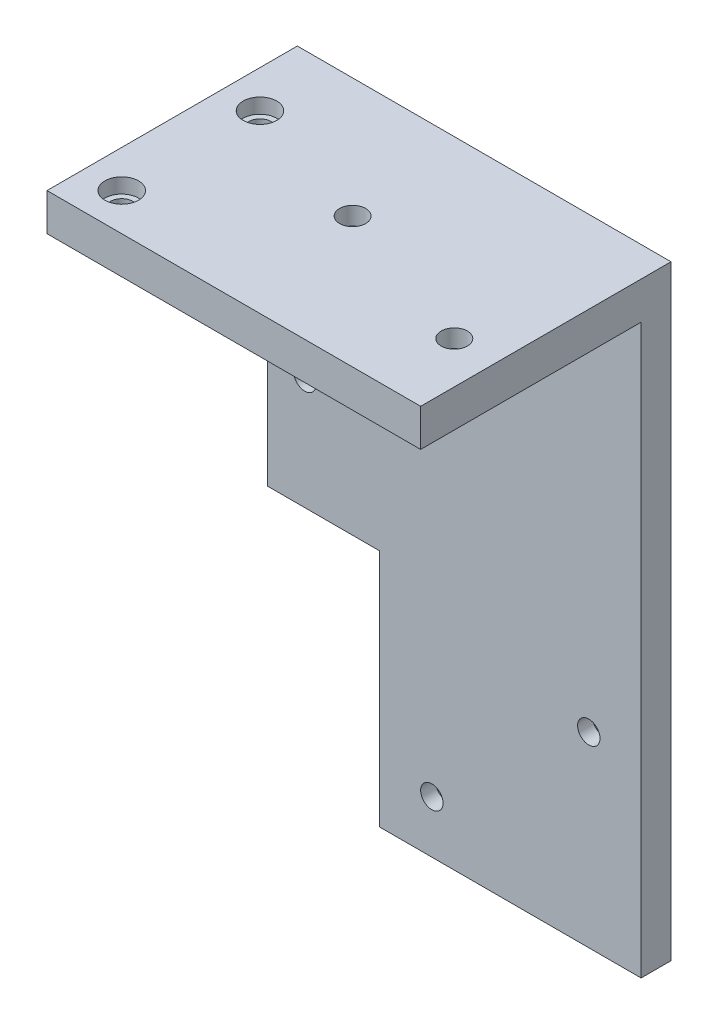
ISO-10303-21;
HEADER;
FILE_DESCRIPTION(('STEP AP214'),'2;1');
FILE_NAME('part.step','',(''),(''),'','','');
FILE_SCHEMA(('AUTOMOTIVE_DESIGN { 1 0 10303 214 1 1 1 1 }'));
ENDSEC;
DATA;
#1=APPLICATION_CONTEXT('core data for automotive mechanical design processes');
#2=APPLICATION_PROTOCOL_DEFINITION('international standard','automotive_design',2000,#1);
#3=PRODUCT_CONTEXT('',#1,'mechanical');
#4=PRODUCT('Part','Part','',(#3));
#5=PRODUCT_RELATED_PRODUCT_CATEGORY('part','',(#4));
#6=PRODUCT_DEFINITION_FORMATION('','',#4);
#7=PRODUCT_DEFINITION_CONTEXT('part definition',#1,'design');
#8=PRODUCT_DEFINITION('design','',#6,#7);
#9=PRODUCT_DEFINITION_SHAPE('','',#8);
#10=(LENGTH_UNIT() NAMED_UNIT(*) SI_UNIT(.MILLI.,.METRE.));
#11=(NAMED_UNIT(*) PLANE_ANGLE_UNIT() SI_UNIT($,.RADIAN.));
#12=(NAMED_UNIT(*) SI_UNIT($,.STERADIAN.) SOLID_ANGLE_UNIT());
#13=UNCERTAINTY_MEASURE_WITH_UNIT(LENGTH_MEASURE(1.E-05),#10,'distance_accuracy_value','');
#14=(GEOMETRIC_REPRESENTATION_CONTEXT(3) GLOBAL_UNCERTAINTY_ASSIGNED_CONTEXT((#13)) GLOBAL_UNIT_ASSIGNED_CONTEXT((#10,
#11,#12)) REPRESENTATION_CONTEXT('',''));
#15=CARTESIAN_POINT('',(0.,0.,0.));
#16=DIRECTION('',(0.,0.,1.));
#17=DIRECTION('',(1.,0.,0.));
#18=AXIS2_PLACEMENT_3D('',#15,#16,#17);
#19=CARTESIAN_POINT('',(22.,-69.,29.5));
#20=DIRECTION('',(0.,0.,-1.));
#21=DIRECTION('',(-1.,0.,0.));
#22=AXIS2_PLACEMENT_3D('',#19,#20,#21);
#23=CYLINDRICAL_SURFACE('',#22,1.5);
#24=CARTESIAN_POINT('',(22.,-69.,0.));
#25=DIRECTION('',(0.,0.,-1.));
#26=DIRECTION('',(-1.,0.,0.));
#27=AXIS2_PLACEMENT_3D('',#24,#25,#26);
#28=CIRCLE('',#27,1.5);
#29=CARTESIAN_POINT('',(20.5,-69.,0.));
#30=VERTEX_POINT('',#29);
#31=EDGE_CURVE('E166',#30,#30,#28,.T.);
#32=ORIENTED_EDGE('',*,*,#31,.F.);
#33=EDGE_LOOP('',(#32));
#34=FACE_BOUND('',#33,.T.);
#35=CARTESIAN_POINT('',(22.,-69.,-2.));
#36=DIRECTION('',(0.,0.,-1.));
#37=DIRECTION('',(-1.,0.,0.));
#38=AXIS2_PLACEMENT_3D('',#35,#36,#37);
#39=CIRCLE('',#38,1.5);
#40=CARTESIAN_POINT('',(20.5,-69.,-2.));
#41=VERTEX_POINT('',#40);
#42=EDGE_CURVE('E69',#41,#41,#39,.F.);
#43=ORIENTED_EDGE('',*,*,#42,.F.);
#44=EDGE_LOOP('',(#43));
#45=FACE_BOUND('',#44,.T.);
#46=ADVANCED_FACE('F65',(#34,#45),#23,.F.);
#47=CARTESIAN_POINT('',(43.,-51.,29.5));
#48=DIRECTION('',(0.,0.,-1.));
#49=DIRECTION('',(-1.,0.,0.));
#50=AXIS2_PLACEMENT_3D('',#47,#48,#49);
#51=CYLINDRICAL_SURFACE('',#50,1.5);
#52=CARTESIAN_POINT('',(43.,-51.,0.));
#53=DIRECTION('',(0.,0.,-1.));
#54=DIRECTION('',(-1.,0.,0.));
#55=AXIS2_PLACEMENT_3D('',#52,#53,#54);
#56=CIRCLE('',#55,1.5);
#57=CARTESIAN_POINT('',(41.5,-51.,0.));
#58=VERTEX_POINT('',#57);
#59=EDGE_CURVE('E183',#58,#58,#56,.T.);
#60=ORIENTED_EDGE('',*,*,#59,.F.);
#61=EDGE_LOOP('',(#60));
#62=FACE_BOUND('',#61,.T.);
#63=CARTESIAN_POINT('',(43.,-51.,-2.));
#64=DIRECTION('',(0.,0.,-1.));
#65=DIRECTION('',(-1.,0.,0.));
#66=AXIS2_PLACEMENT_3D('',#63,#64,#65);
#67=CIRCLE('',#66,1.5);
#68=CARTESIAN_POINT('',(41.5,-51.,-2.));
#69=VERTEX_POINT('',#68);
#70=EDGE_CURVE('E160',#69,#69,#67,.F.);
#71=ORIENTED_EDGE('',*,*,#70,.F.);
#72=EDGE_LOOP('',(#71));
#73=FACE_BOUND('',#72,.T.);
#74=ADVANCED_FACE('F316',(#62,#73),#51,.F.);
#75=CARTESIAN_POINT('',(5.,-29.,29.5));
#76=DIRECTION('',(0.,0.,-1.));
#77=DIRECTION('',(-1.,0.,0.));
#78=AXIS2_PLACEMENT_3D('',#75,#76,#77);
#79=CYLINDRICAL_SURFACE('',#78,1.5);
#80=CARTESIAN_POINT('',(5.,-29.,0.));
#81=DIRECTION('',(0.,0.,-1.));
#82=DIRECTION('',(-1.,0.,0.));
#83=AXIS2_PLACEMENT_3D('',#80,#81,#82);
#84=CIRCLE('',#83,1.5);
#85=CARTESIAN_POINT('',(3.5,-29.,0.));
#86=VERTEX_POINT('',#85);
#87=EDGE_CURVE('E158',#86,#86,#84,.T.);
#88=ORIENTED_EDGE('',*,*,#87,.F.);
#89=EDGE_LOOP('',(#88));
#90=FACE_BOUND('',#89,.T.);
#91=CARTESIAN_POINT('',(5.,-29.,-2.));
#92=DIRECTION('',(0.,0.,-1.));
#93=DIRECTION('',(-1.,0.,0.));
#94=AXIS2_PLACEMENT_3D('',#91,#92,#93);
#95=CIRCLE('',#94,1.5);
#96=CARTESIAN_POINT('',(3.5,-29.,-2.));
#97=VERTEX_POINT('',#96);
#98=EDGE_CURVE('E156',#97,#97,#95,.F.);
#99=ORIENTED_EDGE('',*,*,#98,.F.);
#100=EDGE_LOOP('',(#99));
#101=FACE_BOUND('',#100,.T.);
#102=ADVANCED_FACE('F322',(#90,#101),#79,.F.);
#103=CARTESIAN_POINT('',(5.,-44.,24.5));
#104=DIRECTION('',(0.,1.,0.));
#105=DIRECTION('',(0.,0.,1.));
#106=AXIS2_PLACEMENT_3D('',#103,#104,#105);
#107=CYLINDRICAL_SURFACE('',#106,1.5);
#108=CARTESIAN_POINT('',(5.,0.,24.5));
#109=DIRECTION('',(0.,1.,0.));
#110=DIRECTION('',(0.,0.,1.));
#111=AXIS2_PLACEMENT_3D('',#108,#109,#110);
#112=CIRCLE('',#111,1.5);
#113=CARTESIAN_POINT('',(5.,0.,26.));
#114=VERTEX_POINT('',#113);
#115=EDGE_CURVE('E142',#114,#114,#112,.T.);
#116=ORIENTED_EDGE('',*,*,#115,.F.);
#117=EDGE_LOOP('',(#116));
#118=FACE_BOUND('',#117,.T.);
#119=CARTESIAN_POINT('',(5.,3.,24.5));
#120=DIRECTION('',(0.,1.,0.));
#121=DIRECTION('',(0.,0.,1.));
#122=AXIS2_PLACEMENT_3D('',#119,#120,#121);
#123=CIRCLE('',#122,1.5);
#124=CARTESIAN_POINT('',(5.,3.,26.));
#125=VERTEX_POINT('',#124);
#126=EDGE_CURVE('E146',#125,#125,#123,.F.);
#127=ORIENTED_EDGE('',*,*,#126,.F.);
#128=EDGE_LOOP('',(#127));
#129=FACE_BOUND('',#128,.T.);
#130=ADVANCED_FACE('F344',(#118,#129),#107,.F.);
#131=CARTESIAN_POINT('',(5.,-44.,6.));
#132=DIRECTION('',(0.,1.,0.));
#133=DIRECTION('',(0.,0.,1.));
#134=AXIS2_PLACEMENT_3D('',#131,#132,#133);
#135=CYLINDRICAL_SURFACE('',#134,1.5);
#136=CARTESIAN_POINT('',(5.,0.,6.));
#137=DIRECTION('',(0.,1.,0.));
#138=DIRECTION('',(0.,0.,1.));
#139=AXIS2_PLACEMENT_3D('',#136,#137,#138);
#140=CIRCLE('',#139,1.5);
#141=CARTESIAN_POINT('',(5.,0.,7.5));
#142=VERTEX_POINT('',#141);
#143=EDGE_CURVE('E145',#142,#142,#140,.T.);
#144=ORIENTED_EDGE('',*,*,#143,.F.);
#145=EDGE_LOOP('',(#144));
#146=FACE_BOUND('',#145,.T.);
#147=CARTESIAN_POINT('',(5.,3.,6.));
#148=DIRECTION('',(0.,1.,0.));
#149=DIRECTION('',(0.,0.,1.));
#150=AXIS2_PLACEMENT_3D('',#147,#148,#149);
#151=CIRCLE('',#150,1.5);
#152=CARTESIAN_POINT('',(5.,3.,7.5));
#153=VERTEX_POINT('',#152);
#154=EDGE_CURVE('E150',#153,#153,#151,.F.);
#155=ORIENTED_EDGE('',*,*,#154,.F.);
#156=EDGE_LOOP('',(#155));
#157=FACE_BOUND('',#156,.T.);
#158=ADVANCED_FACE('F357',(#146,#157),#135,.F.);
#159=CARTESIAN_POINT('',(0.,5.,0.));
#160=DIRECTION('',(0.,1.,0.));
#161=DIRECTION('',(0.,0.,1.));
#162=AXIS2_PLACEMENT_3D('',#159,#160,#161);
#163=PLANE('',#162);
#164=CARTESIAN_POINT('',(5.,5.,6.));
#165=DIRECTION('',(0.,1.,0.));
#166=DIRECTION('',(0.,0.,1.));
#167=AXIS2_PLACEMENT_3D('',#164,#165,#166);
#168=CIRCLE('',#167,2.25);
#169=CARTESIAN_POINT('',(5.,5.,8.25));
#170=VERTEX_POINT('',#169);
#171=EDGE_CURVE('E215',#170,#170,#168,.T.);
#172=ORIENTED_EDGE('',*,*,#171,.F.);
#173=EDGE_LOOP('',(#172));
#174=FACE_BOUND('',#173,.T.);
#175=CARTESIAN_POINT('',(5.,5.,24.5));
#176=DIRECTION('',(0.,1.,0.));
#177=DIRECTION('',(0.,0.,1.));
#178=AXIS2_PLACEMENT_3D('',#175,#176,#177);
#179=CIRCLE('',#178,2.25);
#180=CARTESIAN_POINT('',(5.,5.,26.75));
#181=VERTEX_POINT('',#180);
#182=EDGE_CURVE('E218',#181,#181,#179,.T.);
#183=ORIENTED_EDGE('',*,*,#182,.F.);
#184=EDGE_LOOP('',(#183));
#185=FACE_BOUND('',#184,.T.);
#186=CARTESIAN_POINT('',(23.4000000000001,5.,12.0000000000002));
#187=DIRECTION('',(0.,1.,0.));
#188=DIRECTION('',(0.,0.,1.));
#189=AXIS2_PLACEMENT_3D('',#186,#187,#188);
#190=CIRCLE('',#189,1.75);
#191=CARTESIAN_POINT('',(23.4000000000001,5.,13.7500000000002));
#192=VERTEX_POINT('',#191);
#193=EDGE_CURVE('E120',#192,#192,#190,.T.);
#194=ORIENTED_EDGE('',*,*,#193,.F.);
#195=EDGE_LOOP('',(#194));
#196=FACE_BOUND('',#195,.T.);
#197=DIRECTION('',(1.,0.,0.));
#198=VECTOR('',#197,1.);
#199=CARTESIAN_POINT('',(0.,5.,29.5));
#200=LINE('',#199,#198);
#201=CARTESIAN_POINT('',(0.,5.,29.5));
#202=VERTEX_POINT('',#201);
#203=CARTESIAN_POINT('',(50.,5.,29.5));
#204=VERTEX_POINT('',#203);
#205=EDGE_CURVE('E109',#202,#204,#200,.T.);
#206=ORIENTED_EDGE('',*,*,#205,.T.);
#207=DIRECTION('',(0.,0.,-1.));
#208=VECTOR('',#207,1.);
#209=CARTESIAN_POINT('',(50.,5.,29.5));
#210=LINE('',#209,#208);
#211=CARTESIAN_POINT('',(50.,5.,-4.));
#212=VERTEX_POINT('',#211);
#213=EDGE_CURVE('E129',#204,#212,#210,.T.);
#214=ORIENTED_EDGE('',*,*,#213,.T.);
#215=DIRECTION('',(-1.,0.,0.));
#216=VECTOR('',#215,1.);
#217=CARTESIAN_POINT('',(0.,5.,-4.));
#218=LINE('',#217,#216);
#219=CARTESIAN_POINT('',(0.,5.,-4.));
#220=VERTEX_POINT('',#219);
#221=EDGE_CURVE('E149',#212,#220,#218,.T.);
#222=ORIENTED_EDGE('',*,*,#221,.T.);
#223=DIRECTION('',(0.,0.,-1.));
#224=VECTOR('',#223,1.);
#225=CARTESIAN_POINT('',(0.,5.,29.5));
#226=LINE('',#225,#224);
#227=EDGE_CURVE('E111',#202,#220,#226,.T.);
#228=ORIENTED_EDGE('',*,*,#227,.F.);
#229=EDGE_LOOP('',(#206,#214,#222,#228));
#230=FACE_BOUND('',#229,.T.);
#231=CARTESIAN_POINT('',(44.4009523593575,5.,19.4));
#232=DIRECTION('',(0.,1.,0.));
#233=DIRECTION('',(0.,0.,1.));
#234=AXIS2_PLACEMENT_3D('',#231,#232,#233);
#235=CIRCLE('',#234,1.75);
#236=CARTESIAN_POINT('',(44.4009523593575,5.,21.15));
#237=VERTEX_POINT('',#236);
#238=EDGE_CURVE('E141',#237,#237,#235,.T.);
#239=ORIENTED_EDGE('',*,*,#238,.F.);
#240=EDGE_LOOP('',(#239));
#241=FACE_BOUND('',#240,.T.);
#242=ADVANCED_FACE('F298',(#174,#185,#196,#230,#241),#163,.T.);
#243=CARTESIAN_POINT('',(0.,0.,0.));
#244=DIRECTION('',(0.,1.,0.));
#245=DIRECTION('',(0.,0.,1.));
#246=AXIS2_PLACEMENT_3D('',#243,#244,#245);
#247=PLANE('',#246);
#248=ORIENTED_EDGE('',*,*,#143,.T.);
#249=EDGE_LOOP('',(#248));
#250=FACE_BOUND('',#249,.T.);
#251=ORIENTED_EDGE('',*,*,#115,.T.);
#252=EDGE_LOOP('',(#251));
#253=FACE_BOUND('',#252,.T.);
#254=CARTESIAN_POINT('',(23.4000000000001,0.,12.0000000000002));
#255=DIRECTION('',(0.,1.,0.));
#256=DIRECTION('',(0.,0.,1.));
#257=AXIS2_PLACEMENT_3D('',#254,#255,#256);
#258=CIRCLE('',#257,3.1);
#259=CARTESIAN_POINT('',(23.4000000000001,0.,15.1000000000002));
#260=VERTEX_POINT('',#259);
#261=EDGE_CURVE('E244',#260,#260,#258,.T.);
#262=ORIENTED_EDGE('',*,*,#261,.T.);
#263=EDGE_LOOP('',(#262));
#264=FACE_BOUND('',#263,.T.);
#265=CARTESIAN_POINT('',(44.4009523593575,0.,19.4));
#266=DIRECTION('',(0.,1.,0.));
#267=DIRECTION('',(0.,0.,1.));
#268=AXIS2_PLACEMENT_3D('',#265,#266,#267);
#269=CIRCLE('',#268,3.09999999999999);
#270=CARTESIAN_POINT('',(44.4009523593575,0.,22.5));
#271=VERTEX_POINT('',#270);
#272=EDGE_CURVE('E247',#271,#271,#269,.T.);
#273=ORIENTED_EDGE('',*,*,#272,.T.);
#274=EDGE_LOOP('',(#273));
#275=FACE_BOUND('',#274,.T.);
#276=DIRECTION('',(1.,0.,0.));
#277=VECTOR('',#276,1.);
#278=CARTESIAN_POINT('',(0.,0.,29.5));
#279=LINE('',#278,#277);
#280=CARTESIAN_POINT('',(0.,0.,29.5));
#281=VERTEX_POINT('',#280);
#282=CARTESIAN_POINT('',(50.,0.,29.5));
#283=VERTEX_POINT('',#282);
#284=EDGE_CURVE('E107',#281,#283,#279,.T.);
#285=ORIENTED_EDGE('',*,*,#284,.F.);
#286=DIRECTION('',(0.,0.,-1.));
#287=VECTOR('',#286,1.);
#288=CARTESIAN_POINT('',(0.,0.,29.5));
#289=LINE('',#288,#287);
#290=CARTESIAN_POINT('',(0.,0.,0.));
#291=VERTEX_POINT('',#290);
#292=EDGE_CURVE('E117',#281,#291,#289,.T.);
#293=ORIENTED_EDGE('',*,*,#292,.T.);
#294=DIRECTION('',(1.,0.,0.));
#295=VECTOR('',#294,1.);
#296=CARTESIAN_POINT('',(0.,0.,0.));
#297=LINE('',#296,#295);
#298=CARTESIAN_POINT('',(50.,0.,0.));
#299=VERTEX_POINT('',#298);
#300=EDGE_CURVE('E127',#291,#299,#297,.T.);
#301=ORIENTED_EDGE('',*,*,#300,.T.);
#302=DIRECTION('',(0.,0.,-1.));
#303=VECTOR('',#302,1.);
#304=CARTESIAN_POINT('',(50.,0.,29.5));
#305=LINE('',#304,#303);
#306=EDGE_CURVE('E119',#283,#299,#305,.T.);
#307=ORIENTED_EDGE('',*,*,#306,.F.);
#308=EDGE_LOOP('',(#285,#293,#301,#307));
#309=FACE_BOUND('',#308,.T.);
#310=ADVANCED_FACE('F115',(#250,#253,#264,#275,#309),#247,.F.);
#311=CARTESIAN_POINT('',(0.,5.,29.5));
#312=DIRECTION('',(0.,0.,-1.));
#313=DIRECTION('',(-1.,0.,0.));
#314=AXIS2_PLACEMENT_3D('',#311,#312,#313);
#315=PLANE('',#314);
#316=ORIENTED_EDGE('',*,*,#284,.T.);
#317=DIRECTION('',(0.,-1.,0.));
#318=VECTOR('',#317,1.);
#319=CARTESIAN_POINT('',(50.,5.,29.5));
#320=LINE('',#319,#318);
#321=EDGE_CURVE('E12',#204,#283,#320,.T.);
#322=ORIENTED_EDGE('',*,*,#321,.F.);
#323=ORIENTED_EDGE('',*,*,#205,.F.);
#324=DIRECTION('',(0.,-1.,0.));
#325=VECTOR('',#324,1.);
#326=CARTESIAN_POINT('',(0.,5.,29.5));
#327=LINE('',#326,#325);
#328=EDGE_CURVE('E74',#202,#281,#327,.T.);
#329=ORIENTED_EDGE('',*,*,#328,.T.);
#330=EDGE_LOOP('',(#316,#322,#323,#329));
#331=FACE_BOUND('',#330,.T.);
#332=ADVANCED_FACE('F67',(#331),#315,.F.);
#333=CARTESIAN_POINT('',(50.,5.,29.5));
#334=DIRECTION('',(-1.,0.,0.));
#335=DIRECTION('',(0.,0.,1.));
#336=AXIS2_PLACEMENT_3D('',#333,#334,#335);
#337=PLANE('',#336);
#338=ORIENTED_EDGE('',*,*,#306,.T.);
#339=DIRECTION('',(0.,1.,0.));
#340=VECTOR('',#339,1.);
#341=CARTESIAN_POINT('',(50.,-44.,0.));
#342=LINE('',#341,#340);
#343=CARTESIAN_POINT('',(50.,-76.,0.));
#344=VERTEX_POINT('',#343);
#345=EDGE_CURVE('E239',#344,#299,#342,.T.);
#346=ORIENTED_EDGE('',*,*,#345,.F.);
#347=DIRECTION('',(0.,0.,1.));
#348=VECTOR('',#347,1.);
#349=CARTESIAN_POINT('',(50.,-76.,-4.));
#350=LINE('',#349,#348);
#351=CARTESIAN_POINT('',(50.,-76.,-4.));
#352=VERTEX_POINT('',#351);
#353=EDGE_CURVE('E186',#352,#344,#350,.T.);
#354=ORIENTED_EDGE('',*,*,#353,.F.);
#355=DIRECTION('',(0.,1.,0.));
#356=VECTOR('',#355,1.);
#357=CARTESIAN_POINT('',(50.,-44.,-4.));
#358=LINE('',#357,#356);
#359=EDGE_CURVE('E230',#352,#212,#358,.T.);
#360=ORIENTED_EDGE('',*,*,#359,.T.);
#361=ORIENTED_EDGE('',*,*,#213,.F.);
#362=ORIENTED_EDGE('',*,*,#321,.T.);
#363=EDGE_LOOP('',(#338,#346,#354,#360,#361,#362));
#364=FACE_BOUND('',#363,.T.);
#365=ADVANCED_FACE('F260',(#364),#337,.F.);
#366=CARTESIAN_POINT('',(0.,5.,29.5));
#367=DIRECTION('',(-1.,0.,0.));
#368=DIRECTION('',(0.,0.,1.));
#369=AXIS2_PLACEMENT_3D('',#366,#367,#368);
#370=PLANE('',#369);
#371=ORIENTED_EDGE('',*,*,#292,.F.);
#372=ORIENTED_EDGE('',*,*,#328,.F.);
#373=ORIENTED_EDGE('',*,*,#227,.T.);
#374=DIRECTION('',(0.,1.,0.));
#375=VECTOR('',#374,1.);
#376=CARTESIAN_POINT('',(0.,-44.,-4.));
#377=LINE('',#376,#375);
#378=CARTESIAN_POINT('',(0.,-44.,-4.));
#379=VERTEX_POINT('',#378);
#380=EDGE_CURVE('E235',#379,#220,#377,.T.);
#381=ORIENTED_EDGE('',*,*,#380,.F.);
#382=DIRECTION('',(0.,0.,1.));
#383=VECTOR('',#382,1.);
#384=CARTESIAN_POINT('',(0.,-44.,0.));
#385=LINE('',#384,#383);
#386=CARTESIAN_POINT('',(0.,-44.,0.));
#387=VERTEX_POINT('',#386);
#388=EDGE_CURVE('E225',#379,#387,#385,.T.);
#389=ORIENTED_EDGE('',*,*,#388,.T.);
#390=DIRECTION('',(0.,1.,0.));
#391=VECTOR('',#390,1.);
#392=CARTESIAN_POINT('',(0.,-44.,0.));
#393=LINE('',#392,#391);
#394=EDGE_CURVE('E126',#387,#291,#393,.T.);
#395=ORIENTED_EDGE('',*,*,#394,.T.);
#396=EDGE_LOOP('',(#371,#372,#373,#381,#389,#395));
#397=FACE_BOUND('',#396,.T.);
#398=ADVANCED_FACE('F123',(#397),#370,.T.);
#399=CARTESIAN_POINT('',(23.4000000000001,5.,12.0000000000002));
#400=DIRECTION('',(0.,-1.,0.));
#401=DIRECTION('',(0.,0.,-1.));
#402=AXIS2_PLACEMENT_3D('',#399,#400,#401);
#403=CYLINDRICAL_SURFACE('',#402,1.75);
#404=CARTESIAN_POINT('',(23.4000000000001,2.6,12.0000000000002));
#405=DIRECTION('',(0.,1.,0.));
#406=DIRECTION('',(0.,0.,1.));
#407=AXIS2_PLACEMENT_3D('',#404,#405,#406);
#408=CIRCLE('',#407,1.75);
#409=CARTESIAN_POINT('',(23.4000000000001,2.6,13.7500000000002));
#410=VERTEX_POINT('',#409);
#411=EDGE_CURVE('E137',#410,#410,#408,.T.);
#412=ORIENTED_EDGE('',*,*,#411,.F.);
#413=EDGE_LOOP('',(#412));
#414=FACE_BOUND('',#413,.T.);
#415=ORIENTED_EDGE('',*,*,#193,.T.);
#416=EDGE_LOOP('',(#415));
#417=FACE_BOUND('',#416,.T.);
#418=ADVANCED_FACE('F390',(#414,#417),#403,.F.);
#419=CARTESIAN_POINT('',(44.4009523593575,5.,19.4));
#420=DIRECTION('',(0.,-1.,0.));
#421=DIRECTION('',(0.,0.,-1.));
#422=AXIS2_PLACEMENT_3D('',#419,#420,#421);
#423=CYLINDRICAL_SURFACE('',#422,1.75);
#424=CARTESIAN_POINT('',(44.4009523593575,2.6,19.4));
#425=DIRECTION('',(0.,1.,0.));
#426=DIRECTION('',(0.,0.,1.));
#427=AXIS2_PLACEMENT_3D('',#424,#425,#426);
#428=CIRCLE('',#427,1.75);
#429=CARTESIAN_POINT('',(44.4009523593575,2.6,21.15));
#430=VERTEX_POINT('',#429);
#431=EDGE_CURVE('E134',#430,#430,#428,.T.);
#432=ORIENTED_EDGE('',*,*,#431,.F.);
#433=EDGE_LOOP('',(#432));
#434=FACE_BOUND('',#433,.T.);
#435=ORIENTED_EDGE('',*,*,#238,.T.);
#436=EDGE_LOOP('',(#435));
#437=FACE_BOUND('',#436,.T.);
#438=ADVANCED_FACE('F380',(#434,#437),#423,.F.);
#439=CARTESIAN_POINT('',(44.4009523593575,2.6,19.4));
#440=DIRECTION('',(0.,-1.,0.));
#441=DIRECTION('',(0.,0.,-1.));
#442=AXIS2_PLACEMENT_3D('',#439,#440,#441);
#443=CYLINDRICAL_SURFACE('',#442,3.09999999999999);
#444=CARTESIAN_POINT('',(44.4009523593575,2.6,19.4));
#445=DIRECTION('',(0.,1.,0.));
#446=DIRECTION('',(0.,0.,1.));
#447=AXIS2_PLACEMENT_3D('',#444,#445,#446);
#448=CIRCLE('',#447,3.09999999999999);
#449=CARTESIAN_POINT('',(44.4009523593575,2.6,22.5));
#450=VERTEX_POINT('',#449);
#451=EDGE_CURVE('E241',#450,#450,#448,.T.);
#452=ORIENTED_EDGE('',*,*,#451,.T.);
#453=EDGE_LOOP('',(#452));
#454=FACE_BOUND('',#453,.T.);
#455=ORIENTED_EDGE('',*,*,#272,.F.);
#456=EDGE_LOOP('',(#455));
#457=FACE_BOUND('',#456,.T.);
#458=ADVANCED_FACE('F377',(#454,#457),#443,.F.);
#459=CARTESIAN_POINT('',(44.4009523593575,2.6,19.4));
#460=DIRECTION('',(0.,1.,0.));
#461=DIRECTION('',(0.,0.,1.));
#462=AXIS2_PLACEMENT_3D('',#459,#460,#461);
#463=PLANE('',#462);
#464=ORIENTED_EDGE('',*,*,#431,.T.);
#465=EDGE_LOOP('',(#464));
#466=FACE_BOUND('',#465,.T.);
#467=ORIENTED_EDGE('',*,*,#451,.F.);
#468=EDGE_LOOP('',(#467));
#469=FACE_BOUND('',#468,.T.);
#470=ADVANCED_FACE('F379',(#466,#469),#463,.F.);
#471=CARTESIAN_POINT('',(23.4000000000001,2.6,12.0000000000002));
#472=DIRECTION('',(0.,-1.,0.));
#473=DIRECTION('',(0.,0.,-1.));
#474=AXIS2_PLACEMENT_3D('',#471,#472,#473);
#475=CYLINDRICAL_SURFACE('',#474,3.1);
#476=CARTESIAN_POINT('',(23.4000000000001,2.6,12.0000000000002));
#477=DIRECTION('',(0.,1.,0.));
#478=DIRECTION('',(0.,0.,1.));
#479=AXIS2_PLACEMENT_3D('',#476,#477,#478);
#480=CIRCLE('',#479,3.1);
#481=CARTESIAN_POINT('',(23.4000000000001,2.6,15.1000000000002));
#482=VERTEX_POINT('',#481);
#483=EDGE_CURVE('E138',#482,#482,#480,.T.);
#484=ORIENTED_EDGE('',*,*,#483,.T.);
#485=EDGE_LOOP('',(#484));
#486=FACE_BOUND('',#485,.T.);
#487=ORIENTED_EDGE('',*,*,#261,.F.);
#488=EDGE_LOOP('',(#487));
#489=FACE_BOUND('',#488,.T.);
#490=ADVANCED_FACE('F387',(#486,#489),#475,.F.);
#491=CARTESIAN_POINT('',(23.4000000000001,2.6,12.0000000000002));
#492=DIRECTION('',(0.,1.,0.));
#493=DIRECTION('',(0.,0.,1.));
#494=AXIS2_PLACEMENT_3D('',#491,#492,#493);
#495=PLANE('',#494);
#496=ORIENTED_EDGE('',*,*,#411,.T.);
#497=EDGE_LOOP('',(#496));
#498=FACE_BOUND('',#497,.T.);
#499=ORIENTED_EDGE('',*,*,#483,.F.);
#500=EDGE_LOOP('',(#499));
#501=FACE_BOUND('',#500,.T.);
#502=ADVANCED_FACE('F483',(#498,#501),#495,.F.);
#503=CARTESIAN_POINT('',(0.,-44.,0.));
#504=DIRECTION('',(0.,0.,-1.));
#505=DIRECTION('',(-1.,0.,0.));
#506=AXIS2_PLACEMENT_3D('',#503,#504,#505);
#507=PLANE('',#506);
#508=ORIENTED_EDGE('',*,*,#59,.T.);
#509=EDGE_LOOP('',(#508));
#510=FACE_BOUND('',#509,.T.);
#511=ORIENTED_EDGE('',*,*,#31,.T.);
#512=EDGE_LOOP('',(#511));
#513=FACE_BOUND('',#512,.T.);
#514=ORIENTED_EDGE('',*,*,#87,.T.);
#515=EDGE_LOOP('',(#514));
#516=FACE_BOUND('',#515,.T.);
#517=ORIENTED_EDGE('',*,*,#300,.F.);
#518=ORIENTED_EDGE('',*,*,#394,.F.);
#519=DIRECTION('',(-1.,0.,0.));
#520=VECTOR('',#519,1.);
#521=CARTESIAN_POINT('',(0.,-44.,0.));
#522=LINE('',#521,#520);
#523=CARTESIAN_POINT('',(15.,-44.,0.));
#524=VERTEX_POINT('',#523);
#525=EDGE_CURVE('E223',#524,#387,#522,.T.);
#526=ORIENTED_EDGE('',*,*,#525,.F.);
#527=DIRECTION('',(0.,1.,0.));
#528=VECTOR('',#527,1.);
#529=CARTESIAN_POINT('',(15.,-76.,0.));
#530=LINE('',#529,#528);
#531=CARTESIAN_POINT('',(15.,-76.,0.));
#532=VERTEX_POINT('',#531);
#533=EDGE_CURVE('E202',#532,#524,#530,.T.);
#534=ORIENTED_EDGE('',*,*,#533,.F.);
#535=DIRECTION('',(-1.,0.,0.));
#536=VECTOR('',#535,1.);
#537=CARTESIAN_POINT('',(50.,-76.,0.));
#538=LINE('',#537,#536);
#539=EDGE_CURVE('E189',#344,#532,#538,.T.);
#540=ORIENTED_EDGE('',*,*,#539,.F.);
#541=ORIENTED_EDGE('',*,*,#345,.T.);
#542=EDGE_LOOP('',(#517,#518,#526,#534,#540,#541));
#543=FACE_BOUND('',#542,.T.);
#544=ADVANCED_FACE('F266',(#510,#513,#516,#543),#507,.F.);
#545=CARTESIAN_POINT('',(0.,-44.,-4.));
#546=DIRECTION('',(0.,0.,-1.));
#547=DIRECTION('',(-1.,0.,0.));
#548=AXIS2_PLACEMENT_3D('',#545,#546,#547);
#549=PLANE('',#548);
#550=CARTESIAN_POINT('',(43.,-51.,-4.));
#551=DIRECTION('',(0.,0.,-1.));
#552=DIRECTION('',(-1.,0.,0.));
#553=AXIS2_PLACEMENT_3D('',#550,#551,#552);
#554=CIRCLE('',#553,2.25);
#555=CARTESIAN_POINT('',(40.75,-51.,-4.));
#556=VERTEX_POINT('',#555);
#557=EDGE_CURVE('E168',#556,#556,#554,.T.);
#558=ORIENTED_EDGE('',*,*,#557,.F.);
#559=EDGE_LOOP('',(#558));
#560=FACE_BOUND('',#559,.T.);
#561=CARTESIAN_POINT('',(22.,-69.,-4.));
#562=DIRECTION('',(0.,0.,-1.));
#563=DIRECTION('',(-1.,0.,0.));
#564=AXIS2_PLACEMENT_3D('',#561,#562,#563);
#565=CIRCLE('',#564,2.25);
#566=CARTESIAN_POINT('',(19.75,-69.,-4.));
#567=VERTEX_POINT('',#566);
#568=EDGE_CURVE('E173',#567,#567,#565,.T.);
#569=ORIENTED_EDGE('',*,*,#568,.F.);
#570=EDGE_LOOP('',(#569));
#571=FACE_BOUND('',#570,.T.);
#572=CARTESIAN_POINT('',(5.,-29.,-4.));
#573=DIRECTION('',(0.,0.,-1.));
#574=DIRECTION('',(-1.,0.,0.));
#575=AXIS2_PLACEMENT_3D('',#572,#573,#574);
#576=CIRCLE('',#575,2.25);
#577=CARTESIAN_POINT('',(2.75,-29.,-4.));
#578=VERTEX_POINT('',#577);
#579=EDGE_CURVE('E205',#578,#578,#576,.T.);
#580=ORIENTED_EDGE('',*,*,#579,.F.);
#581=EDGE_LOOP('',(#580));
#582=FACE_BOUND('',#581,.T.);
#583=ORIENTED_EDGE('',*,*,#221,.F.);
#584=ORIENTED_EDGE('',*,*,#359,.F.);
#585=DIRECTION('',(1.,0.,0.));
#586=VECTOR('',#585,1.);
#587=CARTESIAN_POINT('',(50.,-76.,-4.));
#588=LINE('',#587,#586);
#589=CARTESIAN_POINT('',(15.,-76.,-4.00000000000001));
#590=VERTEX_POINT('',#589);
#591=EDGE_CURVE('E195',#590,#352,#588,.T.);
#592=ORIENTED_EDGE('',*,*,#591,.F.);
#593=DIRECTION('',(0.,1.,0.));
#594=VECTOR('',#593,1.);
#595=CARTESIAN_POINT('',(15.,-76.,-4.00000000000001));
#596=LINE('',#595,#594);
#597=CARTESIAN_POINT('',(15.,-44.,-4.00000000000001));
#598=VERTEX_POINT('',#597);
#599=EDGE_CURVE('E198',#590,#598,#596,.T.);
#600=ORIENTED_EDGE('',*,*,#599,.T.);
#601=DIRECTION('',(-1.,0.,0.));
#602=VECTOR('',#601,1.);
#603=CARTESIAN_POINT('',(0.,-44.,-4.));
#604=LINE('',#603,#602);
#605=EDGE_CURVE('E227',#598,#379,#604,.T.);
#606=ORIENTED_EDGE('',*,*,#605,.T.);
#607=ORIENTED_EDGE('',*,*,#380,.T.);
#608=EDGE_LOOP('',(#583,#584,#592,#600,#606,#607));
#609=FACE_BOUND('',#608,.T.);
#610=ADVANCED_FACE('F295',(#560,#571,#582,#609),#549,.T.);
#611=CARTESIAN_POINT('',(0.,-44.,0.));
#612=DIRECTION('',(0.,-1.,0.));
#613=DIRECTION('',(0.,0.,-1.));
#614=AXIS2_PLACEMENT_3D('',#611,#612,#613);
#615=PLANE('',#614);
#616=DIRECTION('',(0.,0.,-1.));
#617=VECTOR('',#616,1.);
#618=CARTESIAN_POINT('',(15.,-44.,-4.00000000000001));
#619=LINE('',#618,#617);
#620=EDGE_CURVE('E82',#524,#598,#619,.T.);
#621=ORIENTED_EDGE('',*,*,#620,.F.);
#622=ORIENTED_EDGE('',*,*,#525,.T.);
#623=ORIENTED_EDGE('',*,*,#388,.F.);
#624=ORIENTED_EDGE('',*,*,#605,.F.);
#625=EDGE_LOOP('',(#621,#622,#623,#624));
#626=FACE_BOUND('',#625,.T.);
#627=ADVANCED_FACE('F301',(#626),#615,.T.);
#628=CARTESIAN_POINT('',(5.,3.,6.));
#629=DIRECTION('',(0.,1.,0.));
#630=DIRECTION('',(0.,0.,1.));
#631=AXIS2_PLACEMENT_3D('',#628,#629,#630);
#632=PLANE('',#631);
#633=CARTESIAN_POINT('',(5.,3.,6.));
#634=DIRECTION('',(0.,1.,0.));
#635=DIRECTION('',(0.,0.,1.));
#636=AXIS2_PLACEMENT_3D('',#633,#634,#635);
#637=CIRCLE('',#636,2.25);
#638=CARTESIAN_POINT('',(5.,3.,8.25));
#639=VERTEX_POINT('',#638);
#640=EDGE_CURVE('E153',#639,#639,#637,.T.);
#641=ORIENTED_EDGE('',*,*,#640,.T.);
#642=EDGE_LOOP('',(#641));
#643=FACE_BOUND('',#642,.T.);
#644=ORIENTED_EDGE('',*,*,#154,.T.);
#645=EDGE_LOOP('',(#644));
#646=FACE_BOUND('',#645,.T.);
#647=ADVANCED_FACE('F303',(#643,#646),#632,.T.);
#648=CARTESIAN_POINT('',(5.,3.,6.));
#649=DIRECTION('',(0.,1.,0.));
#650=DIRECTION('',(0.,0.,1.));
#651=AXIS2_PLACEMENT_3D('',#648,#649,#650);
#652=CYLINDRICAL_SURFACE('',#651,2.25);
#653=ORIENTED_EDGE('',*,*,#640,.F.);
#654=EDGE_LOOP('',(#653));
#655=FACE_BOUND('',#654,.T.);
#656=ORIENTED_EDGE('',*,*,#171,.T.);
#657=EDGE_LOOP('',(#656));
#658=FACE_BOUND('',#657,.T.);
#659=ADVANCED_FACE('F309',(#655,#658),#652,.F.);
#660=CARTESIAN_POINT('',(5.,3.,24.5));
#661=DIRECTION('',(0.,1.,0.));
#662=DIRECTION('',(0.,0.,1.));
#663=AXIS2_PLACEMENT_3D('',#660,#661,#662);
#664=PLANE('',#663);
#665=CARTESIAN_POINT('',(5.,3.,24.5));
#666=DIRECTION('',(0.,1.,0.));
#667=DIRECTION('',(0.,0.,1.));
#668=AXIS2_PLACEMENT_3D('',#665,#666,#667);
#669=CIRCLE('',#668,2.25);
#670=CARTESIAN_POINT('',(5.,3.,26.75));
#671=VERTEX_POINT('',#670);
#672=EDGE_CURVE('E212',#671,#671,#669,.T.);
#673=ORIENTED_EDGE('',*,*,#672,.T.);
#674=EDGE_LOOP('',(#673));
#675=FACE_BOUND('',#674,.T.);
#676=ORIENTED_EDGE('',*,*,#126,.T.);
#677=EDGE_LOOP('',(#676));
#678=FACE_BOUND('',#677,.T.);
#679=ADVANCED_FACE('F349',(#675,#678),#664,.T.);
#680=CARTESIAN_POINT('',(5.,3.,24.5));
#681=DIRECTION('',(0.,1.,0.));
#682=DIRECTION('',(0.,0.,1.));
#683=AXIS2_PLACEMENT_3D('',#680,#681,#682);
#684=CYLINDRICAL_SURFACE('',#683,2.25);
#685=ORIENTED_EDGE('',*,*,#672,.F.);
#686=EDGE_LOOP('',(#685));
#687=FACE_BOUND('',#686,.T.);
#688=ORIENTED_EDGE('',*,*,#182,.T.);
#689=EDGE_LOOP('',(#688));
#690=FACE_BOUND('',#689,.T.);
#691=ADVANCED_FACE('F338',(#687,#690),#684,.F.);
#692=CARTESIAN_POINT('',(5.,-29.,-2.));
#693=DIRECTION('',(0.,0.,-1.));
#694=DIRECTION('',(-1.,0.,0.));
#695=AXIS2_PLACEMENT_3D('',#692,#693,#694);
#696=PLANE('',#695);
#697=CARTESIAN_POINT('',(5.,-29.,-2.));
#698=DIRECTION('',(0.,0.,-1.));
#699=DIRECTION('',(-1.,0.,0.));
#700=AXIS2_PLACEMENT_3D('',#697,#698,#699);
#701=CIRCLE('',#700,2.25);
#702=CARTESIAN_POINT('',(2.75,-29.,-2.));
#703=VERTEX_POINT('',#702);
#704=EDGE_CURVE('E159',#703,#703,#701,.T.);
#705=ORIENTED_EDGE('',*,*,#704,.T.);
#706=EDGE_LOOP('',(#705));
#707=FACE_BOUND('',#706,.T.);
#708=ORIENTED_EDGE('',*,*,#98,.T.);
#709=EDGE_LOOP('',(#708));
#710=FACE_BOUND('',#709,.T.);
#711=ADVANCED_FACE('F335',(#707,#710),#696,.T.);
#712=CARTESIAN_POINT('',(5.,-29.,-2.));
#713=DIRECTION('',(0.,0.,-1.));
#714=DIRECTION('',(-1.,0.,0.));
#715=AXIS2_PLACEMENT_3D('',#712,#713,#714);
#716=CYLINDRICAL_SURFACE('',#715,2.25);
#717=ORIENTED_EDGE('',*,*,#704,.F.);
#718=EDGE_LOOP('',(#717));
#719=FACE_BOUND('',#718,.T.);
#720=ORIENTED_EDGE('',*,*,#579,.T.);
#721=EDGE_LOOP('',(#720));
#722=FACE_BOUND('',#721,.T.);
#723=ADVANCED_FACE('F334',(#719,#722),#716,.F.);
#724=CARTESIAN_POINT('',(15.,-76.,-4.00000000000001));
#725=DIRECTION('',(1.,0.,0.));
#726=DIRECTION('',(0.,0.,-1.));
#727=AXIS2_PLACEMENT_3D('',#724,#725,#726);
#728=PLANE('',#727);
#729=ORIENTED_EDGE('',*,*,#620,.T.);
#730=ORIENTED_EDGE('',*,*,#599,.F.);
#731=DIRECTION('',(0.,0.,-1.));
#732=VECTOR('',#731,1.);
#733=CARTESIAN_POINT('',(15.,-76.,-4.00000000000001));
#734=LINE('',#733,#732);
#735=EDGE_CURVE('E192',#532,#590,#734,.T.);
#736=ORIENTED_EDGE('',*,*,#735,.F.);
#737=ORIENTED_EDGE('',*,*,#533,.T.);
#738=EDGE_LOOP('',(#729,#730,#736,#737));
#739=FACE_BOUND('',#738,.T.);
#740=ADVANCED_FACE('F291',(#739),#728,.F.);
#741=CARTESIAN_POINT('',(0.,-76.,0.));
#742=DIRECTION('',(0.,-1.,0.));
#743=DIRECTION('',(0.,0.,-1.));
#744=AXIS2_PLACEMENT_3D('',#741,#742,#743);
#745=PLANE('',#744);
#746=ORIENTED_EDGE('',*,*,#353,.T.);
#747=ORIENTED_EDGE('',*,*,#539,.T.);
#748=ORIENTED_EDGE('',*,*,#735,.T.);
#749=ORIENTED_EDGE('',*,*,#591,.T.);
#750=EDGE_LOOP('',(#746,#747,#748,#749));
#751=FACE_BOUND('',#750,.T.);
#752=ADVANCED_FACE('F287',(#751),#745,.T.);
#753=CARTESIAN_POINT('',(43.,-51.,-2.));
#754=DIRECTION('',(0.,0.,-1.));
#755=DIRECTION('',(-1.,0.,0.));
#756=AXIS2_PLACEMENT_3D('',#753,#754,#755);
#757=PLANE('',#756);
#758=CARTESIAN_POINT('',(43.,-51.,-2.));
#759=DIRECTION('',(0.,0.,-1.));
#760=DIRECTION('',(-1.,0.,0.));
#761=AXIS2_PLACEMENT_3D('',#758,#759,#760);
#762=CIRCLE('',#761,2.25);
#763=CARTESIAN_POINT('',(40.75,-51.,-2.));
#764=VERTEX_POINT('',#763);
#765=EDGE_CURVE('E162',#764,#764,#762,.T.);
#766=ORIENTED_EDGE('',*,*,#765,.T.);
#767=EDGE_LOOP('',(#766));
#768=FACE_BOUND('',#767,.T.);
#769=ORIENTED_EDGE('',*,*,#70,.T.);
#770=EDGE_LOOP('',(#769));
#771=FACE_BOUND('',#770,.T.);
#772=ADVANCED_FACE('F331',(#768,#771),#757,.T.);
#773=CARTESIAN_POINT('',(43.,-51.,-2.));
#774=DIRECTION('',(0.,0.,-1.));
#775=DIRECTION('',(-1.,0.,0.));
#776=AXIS2_PLACEMENT_3D('',#773,#774,#775);
#777=CYLINDRICAL_SURFACE('',#776,2.25);
#778=ORIENTED_EDGE('',*,*,#765,.F.);
#779=EDGE_LOOP('',(#778));
#780=FACE_BOUND('',#779,.T.);
#781=ORIENTED_EDGE('',*,*,#557,.T.);
#782=EDGE_LOOP('',(#781));
#783=FACE_BOUND('',#782,.T.);
#784=ADVANCED_FACE('F522',(#780,#783),#777,.F.);
#785=CARTESIAN_POINT('',(22.,-69.,-2.));
#786=DIRECTION('',(0.,0.,-1.));
#787=DIRECTION('',(-1.,0.,0.));
#788=AXIS2_PLACEMENT_3D('',#785,#786,#787);
#789=PLANE('',#788);
#790=CARTESIAN_POINT('',(22.,-69.,-2.));
#791=DIRECTION('',(0.,0.,-1.));
#792=DIRECTION('',(-1.,0.,0.));
#793=AXIS2_PLACEMENT_3D('',#790,#791,#792);
#794=CIRCLE('',#793,2.25);
#795=CARTESIAN_POINT('',(19.75,-69.,-2.));
#796=VERTEX_POINT('',#795);
#797=EDGE_CURVE('E178',#796,#796,#794,.T.);
#798=ORIENTED_EDGE('',*,*,#797,.T.);
#799=EDGE_LOOP('',(#798));
#800=FACE_BOUND('',#799,.T.);
#801=ORIENTED_EDGE('',*,*,#42,.T.);
#802=EDGE_LOOP('',(#801));
#803=FACE_BOUND('',#802,.T.);
#804=ADVANCED_FACE('F530',(#800,#803),#789,.T.);
#805=CARTESIAN_POINT('',(22.,-69.,-2.));
#806=DIRECTION('',(0.,0.,-1.));
#807=DIRECTION('',(-1.,0.,0.));
#808=AXIS2_PLACEMENT_3D('',#805,#806,#807);
#809=CYLINDRICAL_SURFACE('',#808,2.25);
#810=ORIENTED_EDGE('',*,*,#797,.F.);
#811=EDGE_LOOP('',(#810));
#812=FACE_BOUND('',#811,.T.);
#813=ORIENTED_EDGE('',*,*,#568,.T.);
#814=EDGE_LOOP('',(#813));
#815=FACE_BOUND('',#814,.T.);
#816=ADVANCED_FACE('F539',(#812,#815),#809,.F.);
#817=CLOSED_SHELL('',(#46,#74,#102,#130,#158,#242,#310,#332,#365,#398,#418,#438,#458,#470,#490,
#502,#544,#610,#627,#647,#659,#679,#691,#711,#723,#740,#752,#772,#784,#804,#816));
#818=MANIFOLD_SOLID_BREP('B2',#817);
#819=ADVANCED_BREP_SHAPE_REPRESENTATION('',(#18,#818),#14);
#820=SHAPE_DEFINITION_REPRESENTATION(#9,#819);
ENDSEC;
END-ISO-10303-21;
